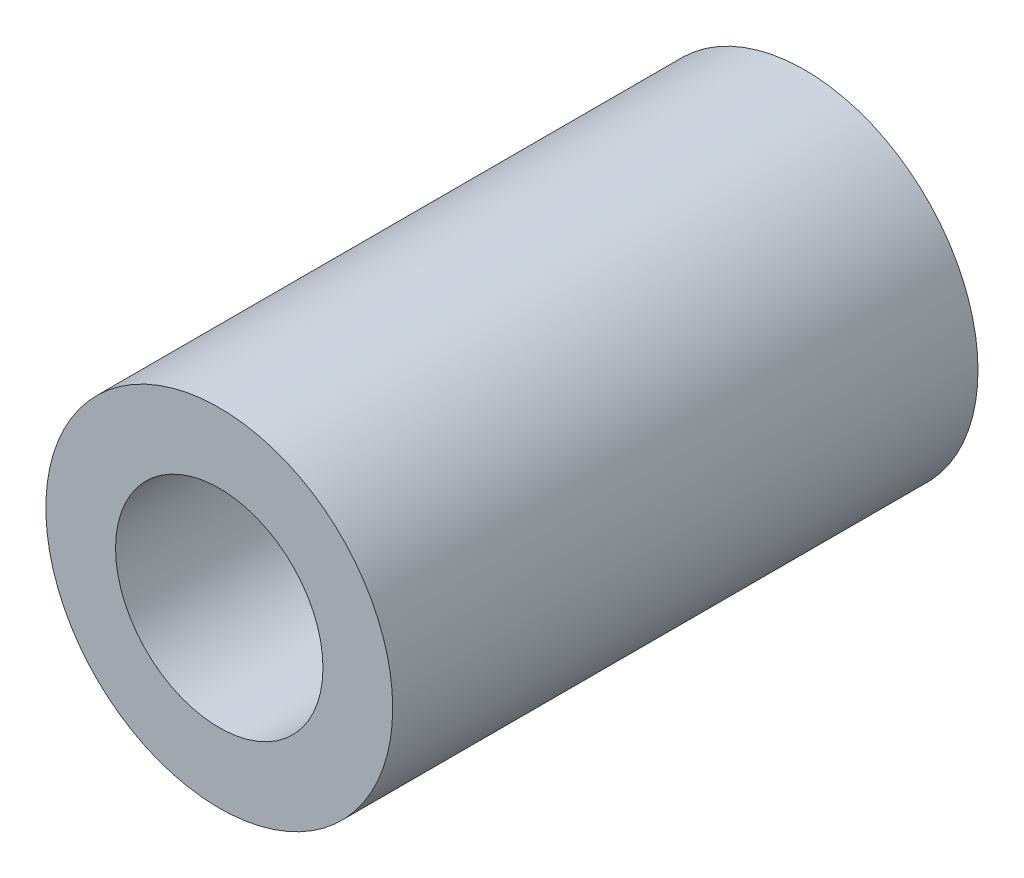
ISO-10303-21;
HEADER;
FILE_DESCRIPTION(('STEP AP214'),'2;1');
FILE_NAME('part.step','',(''),(''),'','','');
FILE_SCHEMA(('AUTOMOTIVE_DESIGN { 1 0 10303 214 1 1 1 1 }'));
ENDSEC;
DATA;
#1=APPLICATION_CONTEXT('core data for automotive mechanical design processes');
#2=APPLICATION_PROTOCOL_DEFINITION('international standard','automotive_design',2000,#1);
#3=PRODUCT_CONTEXT('',#1,'mechanical');
#4=PRODUCT('Part','Part','',(#3));
#5=PRODUCT_RELATED_PRODUCT_CATEGORY('part','',(#4));
#6=PRODUCT_DEFINITION_FORMATION('','',#4);
#7=PRODUCT_DEFINITION_CONTEXT('part definition',#1,'design');
#8=PRODUCT_DEFINITION('design','',#6,#7);
#9=PRODUCT_DEFINITION_SHAPE('','',#8);
#10=(LENGTH_UNIT() NAMED_UNIT(*) SI_UNIT(.MILLI.,.METRE.));
#11=(NAMED_UNIT(*) PLANE_ANGLE_UNIT() SI_UNIT($,.RADIAN.));
#12=(NAMED_UNIT(*) SI_UNIT($,.STERADIAN.) SOLID_ANGLE_UNIT());
#13=UNCERTAINTY_MEASURE_WITH_UNIT(LENGTH_MEASURE(1.E-05),#10,'distance_accuracy_value','');
#14=(GEOMETRIC_REPRESENTATION_CONTEXT(3) GLOBAL_UNCERTAINTY_ASSIGNED_CONTEXT((#13)) GLOBAL_UNIT_ASSIGNED_CONTEXT((#10,
#11,#12)) REPRESENTATION_CONTEXT('',''));
#15=CARTESIAN_POINT('',(0.,0.,0.));
#16=DIRECTION('',(0.,0.,1.));
#17=DIRECTION('',(1.,0.,0.));
#18=AXIS2_PLACEMENT_3D('',#15,#16,#17);
#19=CARTESIAN_POINT('',(0.,0.,10.715625));
#20=DIRECTION('',(0.,0.,1.));
#21=DIRECTION('',(1.,0.,0.));
#22=AXIS2_PLACEMENT_3D('',#19,#20,#21);
#23=PLANE('',#22);
#24=CARTESIAN_POINT('',(0.,0.,10.715625));
#25=DIRECTION('',(0.,0.,1.));
#26=DIRECTION('',(1.,0.,0.));
#27=AXIS2_PLACEMENT_3D('',#24,#25,#26);
#28=CIRCLE('',#27,3.175);
#29=CARTESIAN_POINT('',(3.175,0.,10.715625));
#30=VERTEX_POINT('',#29);
#31=EDGE_CURVE('E10',#30,#30,#28,.T.);
#32=ORIENTED_EDGE('',*,*,#31,.T.);
#33=EDGE_LOOP('',(#32));
#34=FACE_BOUND('',#33,.T.);
#35=CARTESIAN_POINT('',(0.,0.,10.715625));
#36=DIRECTION('',(0.,0.,1.));
#37=DIRECTION('',(1.,0.,0.));
#38=AXIS2_PLACEMENT_3D('',#35,#36,#37);
#39=CIRCLE('',#38,1.89865);
#40=CARTESIAN_POINT('',(1.89865,0.,10.715625));
#41=VERTEX_POINT('',#40);
#42=EDGE_CURVE('E50',#41,#41,#39,.T.);
#43=ORIENTED_EDGE('',*,*,#42,.F.);
#44=EDGE_LOOP('',(#43));
#45=FACE_BOUND('',#44,.T.);
#46=ADVANCED_FACE('F37',(#34,#45),#23,.T.);
#47=CARTESIAN_POINT('',(0.,0.,0.));
#48=DIRECTION('',(0.,0.,1.));
#49=DIRECTION('',(1.,0.,0.));
#50=AXIS2_PLACEMENT_3D('',#47,#48,#49);
#51=PLANE('',#50);
#52=CARTESIAN_POINT('',(0.,0.,0.));
#53=DIRECTION('',(0.,0.,1.));
#54=DIRECTION('',(1.,0.,0.));
#55=AXIS2_PLACEMENT_3D('',#52,#53,#54);
#56=CIRCLE('',#55,3.175);
#57=CARTESIAN_POINT('',(3.175,0.,0.));
#58=VERTEX_POINT('',#57);
#59=EDGE_CURVE('E41',#58,#58,#56,.T.);
#60=ORIENTED_EDGE('',*,*,#59,.F.);
#61=EDGE_LOOP('',(#60));
#62=FACE_BOUND('',#61,.T.);
#63=CARTESIAN_POINT('',(0.,0.,0.));
#64=DIRECTION('',(0.,0.,1.));
#65=DIRECTION('',(1.,0.,0.));
#66=AXIS2_PLACEMENT_3D('',#63,#64,#65);
#67=CIRCLE('',#66,1.89865);
#68=CARTESIAN_POINT('',(1.89865,0.,0.));
#69=VERTEX_POINT('',#68);
#70=EDGE_CURVE('E52',#69,#69,#67,.T.);
#71=ORIENTED_EDGE('',*,*,#70,.T.);
#72=EDGE_LOOP('',(#71));
#73=FACE_BOUND('',#72,.T.);
#74=ADVANCED_FACE('F64',(#62,#73),#51,.F.);
#75=CARTESIAN_POINT('',(0.,0.,10.715625));
#76=DIRECTION('',(0.,0.,-1.));
#77=DIRECTION('',(-1.,0.,0.));
#78=AXIS2_PLACEMENT_3D('',#75,#76,#77);
#79=CYLINDRICAL_SURFACE('',#78,3.175);
#80=ORIENTED_EDGE('',*,*,#31,.F.);
#81=EDGE_LOOP('',(#80));
#82=FACE_BOUND('',#81,.T.);
#83=ORIENTED_EDGE('',*,*,#59,.T.);
#84=EDGE_LOOP('',(#83));
#85=FACE_BOUND('',#84,.T.);
#86=ADVANCED_FACE('F39',(#82,#85),#79,.T.);
#87=CARTESIAN_POINT('',(0.,0.,10.715625));
#88=DIRECTION('',(0.,0.,-1.));
#89=DIRECTION('',(-1.,0.,0.));
#90=AXIS2_PLACEMENT_3D('',#87,#88,#89);
#91=CYLINDRICAL_SURFACE('',#90,1.89865);
#92=ORIENTED_EDGE('',*,*,#42,.T.);
#93=EDGE_LOOP('',(#92));
#94=FACE_BOUND('',#93,.T.);
#95=ORIENTED_EDGE('',*,*,#70,.F.);
#96=EDGE_LOOP('',(#95));
#97=FACE_BOUND('',#96,.T.);
#98=ADVANCED_FACE('F60',(#94,#97),#91,.F.);
#99=CLOSED_SHELL('',(#46,#74,#86,#98));
#100=MANIFOLD_SOLID_BREP('B2',#99);
#101=ADVANCED_BREP_SHAPE_REPRESENTATION('',(#18,#100),#14);
#102=SHAPE_DEFINITION_REPRESENTATION(#9,#101);
ENDSEC;
END-ISO-10303-21;
